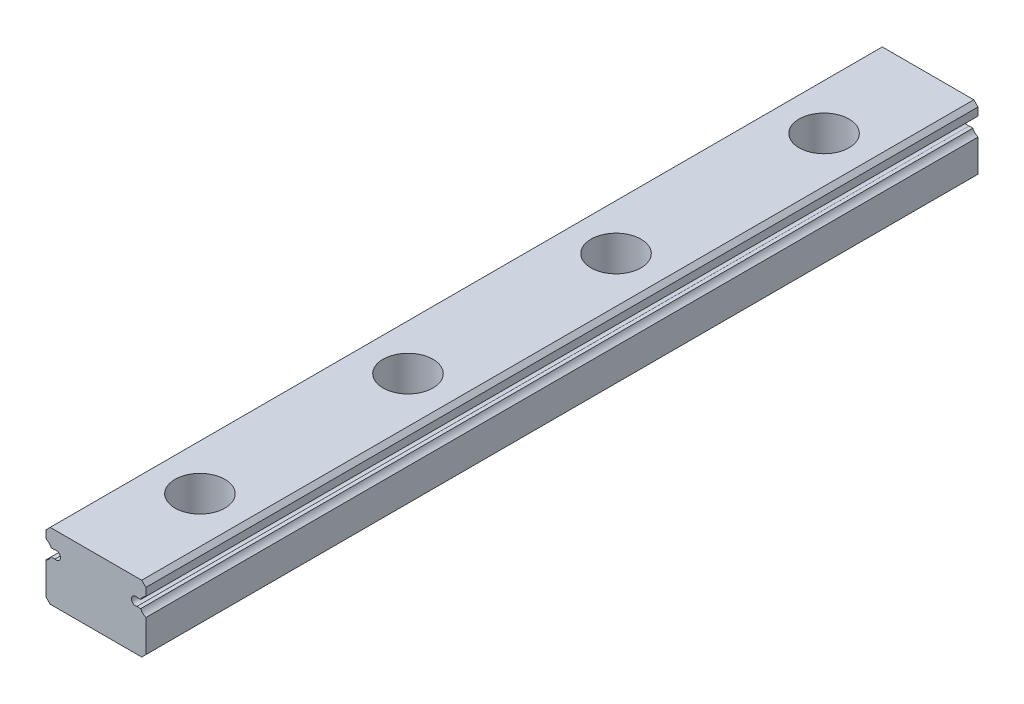
ISO-10303-21;
HEADER;
FILE_DESCRIPTION(('STEP AP214'),'2;1');
FILE_NAME('part.step','',(''),(''),'','','');
FILE_SCHEMA(('AUTOMOTIVE_DESIGN { 1 0 10303 214 1 1 1 1 }'));
ENDSEC;
DATA;
#1=APPLICATION_CONTEXT('core data for automotive mechanical design processes');
#2=APPLICATION_PROTOCOL_DEFINITION('international standard','automotive_design',2000,#1);
#3=PRODUCT_CONTEXT('',#1,'mechanical');
#4=PRODUCT('Part','Part','',(#3));
#5=PRODUCT_RELATED_PRODUCT_CATEGORY('part','',(#4));
#6=PRODUCT_DEFINITION_FORMATION('','',#4);
#7=PRODUCT_DEFINITION_CONTEXT('part definition',#1,'design');
#8=PRODUCT_DEFINITION('design','',#6,#7);
#9=PRODUCT_DEFINITION_SHAPE('','',#8);
#10=(LENGTH_UNIT() NAMED_UNIT(*) SI_UNIT(.MILLI.,.METRE.));
#11=(NAMED_UNIT(*) PLANE_ANGLE_UNIT() SI_UNIT($,.RADIAN.));
#12=(NAMED_UNIT(*) SI_UNIT($,.STERADIAN.) SOLID_ANGLE_UNIT());
#13=UNCERTAINTY_MEASURE_WITH_UNIT(LENGTH_MEASURE(1.E-05),#10,'distance_accuracy_value','');
#14=(GEOMETRIC_REPRESENTATION_CONTEXT(3) GLOBAL_UNCERTAINTY_ASSIGNED_CONTEXT((#13)) GLOBAL_UNIT_ASSIGNED_CONTEXT((#10,
#11,#12)) REPRESENTATION_CONTEXT('',''));
#15=CARTESIAN_POINT('',(0.,0.,0.));
#16=DIRECTION('',(0.,0.,1.));
#17=DIRECTION('',(1.,0.,0.));
#18=AXIS2_PLACEMENT_3D('',#15,#16,#17);
#19=CARTESIAN_POINT('',(6.,0.,100.));
#20=DIRECTION('',(-1.,0.,0.));
#21=DIRECTION('',(0.,0.,1.));
#22=AXIS2_PLACEMENT_3D('',#19,#20,#21);
#23=PLANE('',#22);
#24=DIRECTION('',(0.,1.,0.));
#25=VECTOR('',#24,1.);
#26=CARTESIAN_POINT('',(6.,0.,0.));
#27=LINE('',#26,#25);
#28=CARTESIAN_POINT('',(6.,-3.5,0.));
#29=VERTEX_POINT('',#28);
#30=CARTESIAN_POINT('',(6.,0.368911094364901,0.));
#31=VERTEX_POINT('',#30);
#32=EDGE_CURVE('E212',#29,#31,#27,.T.);
#33=ORIENTED_EDGE('',*,*,#32,.T.);
#34=DIRECTION('',(0.,0.,-1.));
#35=VECTOR('',#34,1.);
#36=CARTESIAN_POINT('',(6.,0.368911094364901,100.));
#37=LINE('',#36,#35);
#38=CARTESIAN_POINT('',(6.,0.368911094364901,100.));
#39=VERTEX_POINT('',#38);
#40=EDGE_CURVE('E11',#39,#31,#37,.T.);
#41=ORIENTED_EDGE('',*,*,#40,.F.);
#42=DIRECTION('',(0.,1.,0.));
#43=VECTOR('',#42,1.);
#44=CARTESIAN_POINT('',(6.,0.,100.));
#45=LINE('',#44,#43);
#46=CARTESIAN_POINT('',(6.,-3.5,100.));
#47=VERTEX_POINT('',#46);
#48=EDGE_CURVE('E264',#47,#39,#45,.T.);
#49=ORIENTED_EDGE('',*,*,#48,.F.);
#50=DIRECTION('',(0.,0.,-1.));
#51=VECTOR('',#50,1.);
#52=CARTESIAN_POINT('',(6.,-3.5,100.));
#53=LINE('',#52,#51);
#54=EDGE_CURVE('E208',#47,#29,#53,.T.);
#55=ORIENTED_EDGE('',*,*,#54,.T.);
#56=EDGE_LOOP('',(#33,#41,#49,#55));
#57=FACE_BOUND('',#56,.T.);
#58=ADVANCED_FACE('F45',(#57),#23,.F.);
#59=CARTESIAN_POINT('',(6.475,1.46,100.));
#60=DIRECTION('',(0.,0.,-1.));
#61=DIRECTION('',(-1.,0.,0.));
#62=AXIS2_PLACEMENT_3D('',#59,#60,#61);
#63=CYLINDRICAL_SURFACE('',#62,1.19);
#64=CARTESIAN_POINT('',(6.475,1.46,0.));
#65=DIRECTION('',(0.,0.,1.));
#66=DIRECTION('',(1.,0.,0.));
#67=AXIS2_PLACEMENT_3D('',#64,#65,#66);
#68=CIRCLE('',#67,1.19);
#69=CARTESIAN_POINT('',(5.3839110943649,0.985,0.));
#70=VERTEX_POINT('',#69);
#71=EDGE_CURVE('E215',#31,#70,#68,.F.);
#72=ORIENTED_EDGE('',*,*,#71,.T.);
#73=DIRECTION('',(0.,0.,-1.));
#74=VECTOR('',#73,1.);
#75=CARTESIAN_POINT('',(5.3839110943649,0.985,100.));
#76=LINE('',#75,#74);
#77=CARTESIAN_POINT('',(5.3839110943649,0.985,100.));
#78=VERTEX_POINT('',#77);
#79=EDGE_CURVE('E53',#78,#70,#76,.T.);
#80=ORIENTED_EDGE('',*,*,#79,.F.);
#81=CARTESIAN_POINT('',(6.475,1.46,100.));
#82=DIRECTION('',(0.,0.,1.));
#83=DIRECTION('',(1.,0.,0.));
#84=AXIS2_PLACEMENT_3D('',#81,#82,#83);
#85=CIRCLE('',#84,1.19);
#86=EDGE_CURVE('E136',#39,#78,#85,.F.);
#87=ORIENTED_EDGE('',*,*,#86,.F.);
#88=ORIENTED_EDGE('',*,*,#40,.T.);
#89=EDGE_LOOP('',(#72,#80,#87,#88));
#90=FACE_BOUND('',#89,.T.);
#91=ADVANCED_FACE('F371',(#90),#63,.F.);
#92=CARTESIAN_POINT('',(0.,0.985000000000015,100.));
#93=DIRECTION('',(0.,-1.,0.));
#94=DIRECTION('',(1.,0.,0.));
#95=AXIS2_PLACEMENT_3D('',#92,#93,#94);
#96=PLANE('',#95);
#97=DIRECTION('',(-1.,0.,0.));
#98=VECTOR('',#97,1.);
#99=CARTESIAN_POINT('',(0.,0.985000000000015,0.));
#100=LINE('',#99,#98);
#101=CARTESIAN_POINT('',(4.92112494995996,0.985000000000002,0.));
#102=VERTEX_POINT('',#101);
#103=EDGE_CURVE('E218',#70,#102,#100,.T.);
#104=ORIENTED_EDGE('',*,*,#103,.T.);
#105=DIRECTION('',(0.,0.,-1.));
#106=VECTOR('',#105,1.);
#107=CARTESIAN_POINT('',(4.92112494995996,0.985000000000002,100.));
#108=LINE('',#107,#106);
#109=CARTESIAN_POINT('',(4.92112494995996,0.985000000000002,100.));
#110=VERTEX_POINT('',#109);
#111=EDGE_CURVE('E296',#110,#102,#108,.T.);
#112=ORIENTED_EDGE('',*,*,#111,.F.);
#113=DIRECTION('',(-1.,0.,0.));
#114=VECTOR('',#113,1.);
#115=CARTESIAN_POINT('',(0.,0.985000000000015,100.));
#116=LINE('',#115,#114);
#117=EDGE_CURVE('E304',#78,#110,#116,.T.);
#118=ORIENTED_EDGE('',*,*,#117,.F.);
#119=ORIENTED_EDGE('',*,*,#79,.T.);
#120=EDGE_LOOP('',(#104,#112,#118,#119));
#121=FACE_BOUND('',#120,.T.);
#122=ADVANCED_FACE('F302',(#121),#96,.F.);
#123=CARTESIAN_POINT('',(4.765,1.46,100.));
#124=DIRECTION('',(0.,0.,-1.));
#125=DIRECTION('',(-1.,0.,0.));
#126=AXIS2_PLACEMENT_3D('',#123,#124,#125);
#127=CYLINDRICAL_SURFACE('',#126,0.5);
#128=CARTESIAN_POINT('',(4.765,1.46,0.));
#129=DIRECTION('',(0.,0.,1.));
#130=DIRECTION('',(1.,0.,0.));
#131=AXIS2_PLACEMENT_3D('',#128,#129,#130);
#132=CIRCLE('',#131,0.5);
#133=CARTESIAN_POINT('',(4.92112494995996,1.935,0.));
#134=VERTEX_POINT('',#133);
#135=EDGE_CURVE('E220',#102,#134,#132,.F.);
#136=ORIENTED_EDGE('',*,*,#135,.T.);
#137=DIRECTION('',(0.,0.,-1.));
#138=VECTOR('',#137,1.);
#139=CARTESIAN_POINT('',(4.92112494995996,1.935,100.));
#140=LINE('',#139,#138);
#141=CARTESIAN_POINT('',(4.92112494995996,1.935,100.));
#142=VERTEX_POINT('',#141);
#143=EDGE_CURVE('E294',#142,#134,#140,.T.);
#144=ORIENTED_EDGE('',*,*,#143,.F.);
#145=CARTESIAN_POINT('',(4.765,1.46,100.));
#146=DIRECTION('',(0.,0.,1.));
#147=DIRECTION('',(1.,0.,0.));
#148=AXIS2_PLACEMENT_3D('',#145,#146,#147);
#149=CIRCLE('',#148,0.5);
#150=EDGE_CURVE('E316',#110,#142,#149,.F.);
#151=ORIENTED_EDGE('',*,*,#150,.F.);
#152=ORIENTED_EDGE('',*,*,#111,.T.);
#153=EDGE_LOOP('',(#136,#144,#151,#152));
#154=FACE_BOUND('',#153,.T.);
#155=ADVANCED_FACE('F313',(#154),#127,.F.);
#156=CARTESIAN_POINT('',(0.,1.93500000000002,100.));
#157=DIRECTION('',(0.,-1.,0.));
#158=DIRECTION('',(1.,0.,0.));
#159=AXIS2_PLACEMENT_3D('',#156,#157,#158);
#160=PLANE('',#159);
#161=DIRECTION('',(-1.,0.,0.));
#162=VECTOR('',#161,1.);
#163=CARTESIAN_POINT('',(0.,1.93500000000002,0.));
#164=LINE('',#163,#162);
#165=CARTESIAN_POINT('',(5.3839110943649,1.935,0.));
#166=VERTEX_POINT('',#165);
#167=EDGE_CURVE('E223',#166,#134,#164,.T.);
#168=ORIENTED_EDGE('',*,*,#167,.F.);
#169=DIRECTION('',(0.,0.,-1.));
#170=VECTOR('',#169,1.);
#171=CARTESIAN_POINT('',(5.3839110943649,1.935,100.));
#172=LINE('',#171,#170);
#173=CARTESIAN_POINT('',(5.3839110943649,1.935,100.));
#174=VERTEX_POINT('',#173);
#175=EDGE_CURVE('E292',#174,#166,#172,.T.);
#176=ORIENTED_EDGE('',*,*,#175,.F.);
#177=DIRECTION('',(-1.,0.,0.));
#178=VECTOR('',#177,1.);
#179=CARTESIAN_POINT('',(0.,1.93500000000002,100.));
#180=LINE('',#179,#178);
#181=EDGE_CURVE('E318',#174,#142,#180,.T.);
#182=ORIENTED_EDGE('',*,*,#181,.T.);
#183=ORIENTED_EDGE('',*,*,#143,.T.);
#184=EDGE_LOOP('',(#168,#176,#182,#183));
#185=FACE_BOUND('',#184,.T.);
#186=ADVANCED_FACE('F382',(#185),#160,.T.);
#187=CARTESIAN_POINT('',(6.475,1.46,100.));
#188=DIRECTION('',(0.,0.,-1.));
#189=DIRECTION('',(-1.,0.,0.));
#190=AXIS2_PLACEMENT_3D('',#187,#188,#189);
#191=CYLINDRICAL_SURFACE('',#190,1.19);
#192=CARTESIAN_POINT('',(6.475,1.46,0.));
#193=DIRECTION('',(0.,0.,1.));
#194=DIRECTION('',(1.,0.,0.));
#195=AXIS2_PLACEMENT_3D('',#192,#193,#194);
#196=CIRCLE('',#195,1.19);
#197=CARTESIAN_POINT('',(6.,2.5510889056351,0.));
#198=VERTEX_POINT('',#197);
#199=EDGE_CURVE('E226',#166,#198,#196,.F.);
#200=ORIENTED_EDGE('',*,*,#199,.T.);
#201=DIRECTION('',(0.,0.,-1.));
#202=VECTOR('',#201,1.);
#203=CARTESIAN_POINT('',(6.,2.5510889056351,100.));
#204=LINE('',#203,#202);
#205=CARTESIAN_POINT('',(6.,2.5510889056351,100.));
#206=VERTEX_POINT('',#205);
#207=EDGE_CURVE('E289',#206,#198,#204,.T.);
#208=ORIENTED_EDGE('',*,*,#207,.F.);
#209=CARTESIAN_POINT('',(6.475,1.46,100.));
#210=DIRECTION('',(0.,0.,1.));
#211=DIRECTION('',(1.,0.,0.));
#212=AXIS2_PLACEMENT_3D('',#209,#210,#211);
#213=CIRCLE('',#212,1.19);
#214=EDGE_CURVE('E320',#174,#206,#213,.F.);
#215=ORIENTED_EDGE('',*,*,#214,.F.);
#216=ORIENTED_EDGE('',*,*,#175,.T.);
#217=EDGE_LOOP('',(#200,#208,#215,#216));
#218=FACE_BOUND('',#217,.T.);
#219=ADVANCED_FACE('F385',(#218),#191,.F.);
#220=CARTESIAN_POINT('',(6.00000000000001,0.,100.));
#221=DIRECTION('',(-1.,0.,0.));
#222=DIRECTION('',(0.,-1.,0.));
#223=AXIS2_PLACEMENT_3D('',#220,#221,#222);
#224=PLANE('',#223);
#225=DIRECTION('',(0.,1.,0.));
#226=VECTOR('',#225,1.);
#227=CARTESIAN_POINT('',(6.00000000000001,0.,0.));
#228=LINE('',#227,#226);
#229=CARTESIAN_POINT('',(6.,3.5,0.));
#230=VERTEX_POINT('',#229);
#231=EDGE_CURVE('E228',#198,#230,#228,.T.);
#232=ORIENTED_EDGE('',*,*,#231,.T.);
#233=DIRECTION('',(0.,0.,-1.));
#234=VECTOR('',#233,1.);
#235=CARTESIAN_POINT('',(6.,3.5,100.));
#236=LINE('',#235,#234);
#237=CARTESIAN_POINT('',(6.,3.5,100.));
#238=VERTEX_POINT('',#237);
#239=EDGE_CURVE('E287',#238,#230,#236,.T.);
#240=ORIENTED_EDGE('',*,*,#239,.F.);
#241=DIRECTION('',(0.,1.,0.));
#242=VECTOR('',#241,1.);
#243=CARTESIAN_POINT('',(6.00000000000001,0.,100.));
#244=LINE('',#243,#242);
#245=EDGE_CURVE('E326',#206,#238,#244,.T.);
#246=ORIENTED_EDGE('',*,*,#245,.F.);
#247=ORIENTED_EDGE('',*,*,#207,.T.);
#248=EDGE_LOOP('',(#232,#240,#246,#247));
#249=FACE_BOUND('',#248,.T.);
#250=ADVANCED_FACE('F389',(#249),#224,.F.);
#251=CARTESIAN_POINT('',(4.74999999999999,4.75,100.));
#252=DIRECTION('',(0.707106781186547,0.707106781186548,0.));
#253=DIRECTION('',(-0.707106781186548,0.707106781186547,0.));
#254=AXIS2_PLACEMENT_3D('',#251,#252,#253);
#255=PLANE('',#254);
#256=DIRECTION('',(0.707106781186548,-0.707106781186547,0.));
#257=VECTOR('',#256,1.);
#258=CARTESIAN_POINT('',(4.74999999999999,4.75,0.));
#259=LINE('',#258,#257);
#260=CARTESIAN_POINT('',(5.5,4.,0.));
#261=VERTEX_POINT('',#260);
#262=EDGE_CURVE('E231',#261,#230,#259,.T.);
#263=ORIENTED_EDGE('',*,*,#262,.F.);
#264=DIRECTION('',(0.,0.,-1.));
#265=VECTOR('',#264,1.);
#266=CARTESIAN_POINT('',(5.5,4.,100.));
#267=LINE('',#266,#265);
#268=CARTESIAN_POINT('',(5.5,4.,100.));
#269=VERTEX_POINT('',#268);
#270=EDGE_CURVE('E285',#269,#261,#267,.T.);
#271=ORIENTED_EDGE('',*,*,#270,.F.);
#272=DIRECTION('',(0.707106781186548,-0.707106781186547,0.));
#273=VECTOR('',#272,1.);
#274=CARTESIAN_POINT('',(4.74999999999999,4.75,100.));
#275=LINE('',#274,#273);
#276=EDGE_CURVE('E328',#269,#238,#275,.T.);
#277=ORIENTED_EDGE('',*,*,#276,.T.);
#278=ORIENTED_EDGE('',*,*,#239,.T.);
#279=EDGE_LOOP('',(#263,#271,#277,#278));
#280=FACE_BOUND('',#279,.T.);
#281=ADVANCED_FACE('F393',(#280),#255,.T.);
#282=CARTESIAN_POINT('',(0.,4.,100.));
#283=DIRECTION('',(0.,-1.,0.));
#284=DIRECTION('',(1.,0.,0.));
#285=AXIS2_PLACEMENT_3D('',#282,#283,#284);
#286=PLANE('',#285);
#287=CARTESIAN_POINT('',(0.,4.,87.5));
#288=DIRECTION('',(0.,1.,0.));
#289=DIRECTION('',(-1.,0.,0.));
#290=AXIS2_PLACEMENT_3D('',#287,#288,#289);
#291=CIRCLE('',#290,3.);
#292=CARTESIAN_POINT('',(-3.,4.,87.5));
#293=VERTEX_POINT('',#292);
#294=EDGE_CURVE('E687',#293,#293,#291,.T.);
#295=ORIENTED_EDGE('',*,*,#294,.F.);
#296=EDGE_LOOP('',(#295));
#297=FACE_BOUND('',#296,.T.);
#298=CARTESIAN_POINT('',(0.,4.,62.5));
#299=DIRECTION('',(0.,1.,0.));
#300=DIRECTION('',(-1.,0.,0.));
#301=AXIS2_PLACEMENT_3D('',#298,#299,#300);
#302=CIRCLE('',#301,3.);
#303=CARTESIAN_POINT('',(-3.,4.,62.5));
#304=VERTEX_POINT('',#303);
#305=EDGE_CURVE('E698',#304,#304,#302,.T.);
#306=ORIENTED_EDGE('',*,*,#305,.F.);
#307=EDGE_LOOP('',(#306));
#308=FACE_BOUND('',#307,.T.);
#309=CARTESIAN_POINT('',(0.,4.,37.5));
#310=DIRECTION('',(0.,1.,0.));
#311=DIRECTION('',(-1.,0.,0.));
#312=AXIS2_PLACEMENT_3D('',#309,#310,#311);
#313=CIRCLE('',#312,3.);
#314=CARTESIAN_POINT('',(-3.,4.,37.5));
#315=VERTEX_POINT('',#314);
#316=EDGE_CURVE('E710',#315,#315,#313,.T.);
#317=ORIENTED_EDGE('',*,*,#316,.F.);
#318=EDGE_LOOP('',(#317));
#319=FACE_BOUND('',#318,.T.);
#320=CARTESIAN_POINT('',(0.,4.,12.5));
#321=DIRECTION('',(0.,1.,0.));
#322=DIRECTION('',(-1.,0.,0.));
#323=AXIS2_PLACEMENT_3D('',#320,#321,#322);
#324=CIRCLE('',#323,3.);
#325=CARTESIAN_POINT('',(-3.,4.,12.5));
#326=VERTEX_POINT('',#325);
#327=EDGE_CURVE('E723',#326,#326,#324,.T.);
#328=ORIENTED_EDGE('',*,*,#327,.F.);
#329=EDGE_LOOP('',(#328));
#330=FACE_BOUND('',#329,.T.);
#331=DIRECTION('',(-1.,0.,0.));
#332=VECTOR('',#331,1.);
#333=CARTESIAN_POINT('',(0.,4.,0.));
#334=LINE('',#333,#332);
#335=CARTESIAN_POINT('',(-5.5,4.,0.));
#336=VERTEX_POINT('',#335);
#337=EDGE_CURVE('E234',#261,#336,#334,.T.);
#338=ORIENTED_EDGE('',*,*,#337,.T.);
#339=DIRECTION('',(0.,0.,-1.));
#340=VECTOR('',#339,1.);
#341=CARTESIAN_POINT('',(-5.5,4.,100.));
#342=LINE('',#341,#340);
#343=CARTESIAN_POINT('',(-5.5,4.,100.));
#344=VERTEX_POINT('',#343);
#345=EDGE_CURVE('E282',#344,#336,#342,.T.);
#346=ORIENTED_EDGE('',*,*,#345,.F.);
#347=DIRECTION('',(-1.,0.,0.));
#348=VECTOR('',#347,1.);
#349=CARTESIAN_POINT('',(0.,4.,100.));
#350=LINE('',#349,#348);
#351=EDGE_CURVE('E331',#269,#344,#350,.T.);
#352=ORIENTED_EDGE('',*,*,#351,.F.);
#353=ORIENTED_EDGE('',*,*,#270,.T.);
#354=EDGE_LOOP('',(#338,#346,#352,#353));
#355=FACE_BOUND('',#354,.T.);
#356=ADVANCED_FACE('F397',(#297,#308,#319,#330,#355),#286,.F.);
#357=CARTESIAN_POINT('',(-4.75,4.75,100.));
#358=DIRECTION('',(0.707106781186547,-0.707106781186548,0.));
#359=DIRECTION('',(0.707106781186548,0.707106781186547,0.));
#360=AXIS2_PLACEMENT_3D('',#357,#358,#359);
#361=PLANE('',#360);
#362=DIRECTION('',(-0.707106781186548,-0.707106781186547,0.));
#363=VECTOR('',#362,1.);
#364=CARTESIAN_POINT('',(-4.75,4.75,0.));
#365=LINE('',#364,#363);
#366=CARTESIAN_POINT('',(-6.,3.5,0.));
#367=VERTEX_POINT('',#366);
#368=EDGE_CURVE('E236',#336,#367,#365,.T.);
#369=ORIENTED_EDGE('',*,*,#368,.T.);
#370=DIRECTION('',(0.,0.,-1.));
#371=VECTOR('',#370,1.);
#372=CARTESIAN_POINT('',(-6.,3.5,100.));
#373=LINE('',#372,#371);
#374=CARTESIAN_POINT('',(-6.,3.5,100.));
#375=VERTEX_POINT('',#374);
#376=EDGE_CURVE('E280',#375,#367,#373,.T.);
#377=ORIENTED_EDGE('',*,*,#376,.F.);
#378=DIRECTION('',(-0.707106781186548,-0.707106781186547,0.));
#379=VECTOR('',#378,1.);
#380=CARTESIAN_POINT('',(-4.75,4.75,100.));
#381=LINE('',#380,#379);
#382=EDGE_CURVE('E333',#344,#375,#381,.T.);
#383=ORIENTED_EDGE('',*,*,#382,.F.);
#384=ORIENTED_EDGE('',*,*,#345,.T.);
#385=EDGE_LOOP('',(#369,#377,#383,#384));
#386=FACE_BOUND('',#385,.T.);
#387=ADVANCED_FACE('F401',(#386),#361,.F.);
#388=CARTESIAN_POINT('',(-6.,0.,100.));
#389=DIRECTION('',(-1.,0.,0.));
#390=DIRECTION('',(0.,0.,1.));
#391=AXIS2_PLACEMENT_3D('',#388,#389,#390);
#392=PLANE('',#391);
#393=DIRECTION('',(0.,1.,0.));
#394=VECTOR('',#393,1.);
#395=CARTESIAN_POINT('',(-6.,0.,0.));
#396=LINE('',#395,#394);
#397=CARTESIAN_POINT('',(-6.,2.5510889056351,0.));
#398=VERTEX_POINT('',#397);
#399=EDGE_CURVE('E239',#398,#367,#396,.T.);
#400=ORIENTED_EDGE('',*,*,#399,.F.);
#401=DIRECTION('',(0.,0.,-1.));
#402=VECTOR('',#401,1.);
#403=CARTESIAN_POINT('',(-6.,2.5510889056351,100.));
#404=LINE('',#403,#402);
#405=CARTESIAN_POINT('',(-6.,2.5510889056351,100.));
#406=VERTEX_POINT('',#405);
#407=EDGE_CURVE('E278',#406,#398,#404,.T.);
#408=ORIENTED_EDGE('',*,*,#407,.F.);
#409=DIRECTION('',(0.,1.,0.));
#410=VECTOR('',#409,1.);
#411=CARTESIAN_POINT('',(-6.,0.,100.));
#412=LINE('',#411,#410);
#413=EDGE_CURVE('E335',#406,#375,#412,.T.);
#414=ORIENTED_EDGE('',*,*,#413,.T.);
#415=ORIENTED_EDGE('',*,*,#376,.T.);
#416=EDGE_LOOP('',(#400,#408,#414,#415));
#417=FACE_BOUND('',#416,.T.);
#418=ADVANCED_FACE('F405',(#417),#392,.T.);
#419=CARTESIAN_POINT('',(-6.475,1.46,100.));
#420=DIRECTION('',(0.,0.,-1.));
#421=DIRECTION('',(-1.,0.,0.));
#422=AXIS2_PLACEMENT_3D('',#419,#420,#421);
#423=CYLINDRICAL_SURFACE('',#422,1.19);
#424=CARTESIAN_POINT('',(-6.475,1.46,0.));
#425=DIRECTION('',(0.,0.,1.));
#426=DIRECTION('',(1.,0.,0.));
#427=AXIS2_PLACEMENT_3D('',#424,#425,#426);
#428=CIRCLE('',#427,1.19);
#429=CARTESIAN_POINT('',(-5.3839110943649,1.935,0.));
#430=VERTEX_POINT('',#429);
#431=EDGE_CURVE('E242',#430,#398,#428,.T.);
#432=ORIENTED_EDGE('',*,*,#431,.F.);
#433=DIRECTION('',(0.,0.,-1.));
#434=VECTOR('',#433,1.);
#435=CARTESIAN_POINT('',(-5.3839110943649,1.935,100.));
#436=LINE('',#435,#434);
#437=CARTESIAN_POINT('',(-5.3839110943649,1.935,100.));
#438=VERTEX_POINT('',#437);
#439=EDGE_CURVE('E276',#438,#430,#436,.T.);
#440=ORIENTED_EDGE('',*,*,#439,.F.);
#441=CARTESIAN_POINT('',(-6.475,1.46,100.));
#442=DIRECTION('',(0.,0.,1.));
#443=DIRECTION('',(1.,0.,0.));
#444=AXIS2_PLACEMENT_3D('',#441,#442,#443);
#445=CIRCLE('',#444,1.19);
#446=EDGE_CURVE('E338',#438,#406,#445,.T.);
#447=ORIENTED_EDGE('',*,*,#446,.T.);
#448=ORIENTED_EDGE('',*,*,#407,.T.);
#449=EDGE_LOOP('',(#432,#440,#447,#448));
#450=FACE_BOUND('',#449,.T.);
#451=ADVANCED_FACE('F409',(#450),#423,.F.);
#452=CARTESIAN_POINT('',(0.,1.935,100.));
#453=DIRECTION('',(0.,1.,0.));
#454=DIRECTION('',(0.,0.,1.));
#455=AXIS2_PLACEMENT_3D('',#452,#453,#454);
#456=PLANE('',#455);
#457=DIRECTION('',(1.,0.,0.));
#458=VECTOR('',#457,1.);
#459=CARTESIAN_POINT('',(0.,1.935,0.));
#460=LINE('',#459,#458);
#461=CARTESIAN_POINT('',(-4.92112494995996,1.935,0.));
#462=VERTEX_POINT('',#461);
#463=EDGE_CURVE('E245',#430,#462,#460,.T.);
#464=ORIENTED_EDGE('',*,*,#463,.T.);
#465=DIRECTION('',(0.,0.,-1.));
#466=VECTOR('',#465,1.);
#467=CARTESIAN_POINT('',(-4.92112494995996,1.935,100.));
#468=LINE('',#467,#466);
#469=CARTESIAN_POINT('',(-4.92112494995996,1.935,100.));
#470=VERTEX_POINT('',#469);
#471=EDGE_CURVE('E274',#470,#462,#468,.T.);
#472=ORIENTED_EDGE('',*,*,#471,.F.);
#473=DIRECTION('',(1.,0.,0.));
#474=VECTOR('',#473,1.);
#475=CARTESIAN_POINT('',(0.,1.935,100.));
#476=LINE('',#475,#474);
#477=EDGE_CURVE('E341',#438,#470,#476,.T.);
#478=ORIENTED_EDGE('',*,*,#477,.F.);
#479=ORIENTED_EDGE('',*,*,#439,.T.);
#480=EDGE_LOOP('',(#464,#472,#478,#479));
#481=FACE_BOUND('',#480,.T.);
#482=ADVANCED_FACE('F413',(#481),#456,.F.);
#483=CARTESIAN_POINT('',(-4.765,1.46,100.));
#484=DIRECTION('',(0.,0.,-1.));
#485=DIRECTION('',(-1.,0.,0.));
#486=AXIS2_PLACEMENT_3D('',#483,#484,#485);
#487=CYLINDRICAL_SURFACE('',#486,0.5);
#488=CARTESIAN_POINT('',(-4.765,1.46,0.));
#489=DIRECTION('',(0.,0.,1.));
#490=DIRECTION('',(1.,0.,0.));
#491=AXIS2_PLACEMENT_3D('',#488,#489,#490);
#492=CIRCLE('',#491,0.5);
#493=CARTESIAN_POINT('',(-4.92112494995996,0.984999999999999,0.));
#494=VERTEX_POINT('',#493);
#495=EDGE_CURVE('E248',#494,#462,#492,.T.);
#496=ORIENTED_EDGE('',*,*,#495,.F.);
#497=DIRECTION('',(0.,0.,-1.));
#498=VECTOR('',#497,1.);
#499=CARTESIAN_POINT('',(-4.92112494995996,0.984999999999999,100.));
#500=LINE('',#499,#498);
#501=CARTESIAN_POINT('',(-4.92112494995996,0.984999999999999,100.));
#502=VERTEX_POINT('',#501);
#503=EDGE_CURVE('E272',#502,#494,#500,.T.);
#504=ORIENTED_EDGE('',*,*,#503,.F.);
#505=CARTESIAN_POINT('',(-4.765,1.46,100.));
#506=DIRECTION('',(0.,0.,1.));
#507=DIRECTION('',(1.,0.,0.));
#508=AXIS2_PLACEMENT_3D('',#505,#506,#507);
#509=CIRCLE('',#508,0.5);
#510=EDGE_CURVE('E343',#502,#470,#509,.T.);
#511=ORIENTED_EDGE('',*,*,#510,.T.);
#512=ORIENTED_EDGE('',*,*,#471,.T.);
#513=EDGE_LOOP('',(#496,#504,#511,#512));
#514=FACE_BOUND('',#513,.T.);
#515=ADVANCED_FACE('F417',(#514),#487,.F.);
#516=CARTESIAN_POINT('',(0.,0.984999999999999,100.));
#517=DIRECTION('',(0.,1.,0.));
#518=DIRECTION('',(0.,0.,1.));
#519=AXIS2_PLACEMENT_3D('',#516,#517,#518);
#520=PLANE('',#519);
#521=DIRECTION('',(1.,0.,0.));
#522=VECTOR('',#521,1.);
#523=CARTESIAN_POINT('',(0.,0.984999999999999,0.));
#524=LINE('',#523,#522);
#525=CARTESIAN_POINT('',(-5.3839110943649,0.984999999999999,0.));
#526=VERTEX_POINT('',#525);
#527=EDGE_CURVE('E251',#526,#494,#524,.T.);
#528=ORIENTED_EDGE('',*,*,#527,.F.);
#529=DIRECTION('',(0.,0.,-1.));
#530=VECTOR('',#529,1.);
#531=CARTESIAN_POINT('',(-5.3839110943649,0.984999999999999,100.));
#532=LINE('',#531,#530);
#533=CARTESIAN_POINT('',(-5.3839110943649,0.984999999999999,100.));
#534=VERTEX_POINT('',#533);
#535=EDGE_CURVE('E270',#534,#526,#532,.T.);
#536=ORIENTED_EDGE('',*,*,#535,.F.);
#537=DIRECTION('',(1.,0.,0.));
#538=VECTOR('',#537,1.);
#539=CARTESIAN_POINT('',(0.,0.984999999999999,100.));
#540=LINE('',#539,#538);
#541=EDGE_CURVE('E346',#534,#502,#540,.T.);
#542=ORIENTED_EDGE('',*,*,#541,.T.);
#543=ORIENTED_EDGE('',*,*,#503,.T.);
#544=EDGE_LOOP('',(#528,#536,#542,#543));
#545=FACE_BOUND('',#544,.T.);
#546=ADVANCED_FACE('F421',(#545),#520,.T.);
#547=CARTESIAN_POINT('',(-6.475,1.46,100.));
#548=DIRECTION('',(0.,0.,-1.));
#549=DIRECTION('',(-1.,0.,0.));
#550=AXIS2_PLACEMENT_3D('',#547,#548,#549);
#551=CYLINDRICAL_SURFACE('',#550,1.19);
#552=CARTESIAN_POINT('',(-6.475,1.46,0.));
#553=DIRECTION('',(0.,0.,1.));
#554=DIRECTION('',(1.,0.,0.));
#555=AXIS2_PLACEMENT_3D('',#552,#553,#554);
#556=CIRCLE('',#555,1.19);
#557=CARTESIAN_POINT('',(-6.,0.3689110943649,0.));
#558=VERTEX_POINT('',#557);
#559=EDGE_CURVE('E254',#558,#526,#556,.T.);
#560=ORIENTED_EDGE('',*,*,#559,.F.);
#561=DIRECTION('',(0.,0.,-1.));
#562=VECTOR('',#561,1.);
#563=CARTESIAN_POINT('',(-6.,0.3689110943649,100.));
#564=LINE('',#563,#562);
#565=CARTESIAN_POINT('',(-6.,0.3689110943649,100.));
#566=VERTEX_POINT('',#565);
#567=EDGE_CURVE('E268',#566,#558,#564,.T.);
#568=ORIENTED_EDGE('',*,*,#567,.F.);
#569=CARTESIAN_POINT('',(-6.475,1.46,100.));
#570=DIRECTION('',(0.,0.,1.));
#571=DIRECTION('',(1.,0.,0.));
#572=AXIS2_PLACEMENT_3D('',#569,#570,#571);
#573=CIRCLE('',#572,1.19);
#574=EDGE_CURVE('E349',#566,#534,#573,.T.);
#575=ORIENTED_EDGE('',*,*,#574,.T.);
#576=ORIENTED_EDGE('',*,*,#535,.T.);
#577=EDGE_LOOP('',(#560,#568,#575,#576));
#578=FACE_BOUND('',#577,.T.);
#579=ADVANCED_FACE('F425',(#578),#551,.F.);
#580=CARTESIAN_POINT('',(-6.,0.,100.));
#581=DIRECTION('',(-1.,0.,0.));
#582=DIRECTION('',(0.,0.,1.));
#583=AXIS2_PLACEMENT_3D('',#580,#581,#582);
#584=PLANE('',#583);
#585=DIRECTION('',(0.,1.,0.));
#586=VECTOR('',#585,1.);
#587=CARTESIAN_POINT('',(-6.,0.,0.));
#588=LINE('',#587,#586);
#589=CARTESIAN_POINT('',(-6.,-3.5,0.));
#590=VERTEX_POINT('',#589);
#591=EDGE_CURVE('E257',#590,#558,#588,.T.);
#592=ORIENTED_EDGE('',*,*,#591,.F.);
#593=DIRECTION('',(0.,0.,-1.));
#594=VECTOR('',#593,1.);
#595=CARTESIAN_POINT('',(-6.,-3.5,100.));
#596=LINE('',#595,#594);
#597=CARTESIAN_POINT('',(-6.,-3.5,100.));
#598=VERTEX_POINT('',#597);
#599=EDGE_CURVE('E197',#598,#590,#596,.T.);
#600=ORIENTED_EDGE('',*,*,#599,.F.);
#601=DIRECTION('',(0.,1.,0.));
#602=VECTOR('',#601,1.);
#603=CARTESIAN_POINT('',(-6.,0.,100.));
#604=LINE('',#603,#602);
#605=EDGE_CURVE('E204',#598,#566,#604,.T.);
#606=ORIENTED_EDGE('',*,*,#605,.T.);
#607=ORIENTED_EDGE('',*,*,#567,.T.);
#608=EDGE_LOOP('',(#592,#600,#606,#607));
#609=FACE_BOUND('',#608,.T.);
#610=ADVANCED_FACE('F353',(#609),#584,.T.);
#611=CARTESIAN_POINT('',(-4.75,-4.75,100.));
#612=DIRECTION('',(-0.707106781186548,-0.707106781186547,0.));
#613=DIRECTION('',(0.707106781186547,-0.707106781186548,0.));
#614=AXIS2_PLACEMENT_3D('',#611,#612,#613);
#615=PLANE('',#614);
#616=DIRECTION('',(-0.707106781186547,0.707106781186548,0.));
#617=VECTOR('',#616,1.);
#618=CARTESIAN_POINT('',(-4.75,-4.75,0.));
#619=LINE('',#618,#617);
#620=CARTESIAN_POINT('',(-5.5,-4.,0.));
#621=VERTEX_POINT('',#620);
#622=EDGE_CURVE('E192',#621,#590,#619,.T.);
#623=ORIENTED_EDGE('',*,*,#622,.F.);
#624=DIRECTION('',(0.,0.,-1.));
#625=VECTOR('',#624,1.);
#626=CARTESIAN_POINT('',(-5.5,-4.,100.));
#627=LINE('',#626,#625);
#628=CARTESIAN_POINT('',(-5.5,-4.,100.));
#629=VERTEX_POINT('',#628);
#630=EDGE_CURVE('E187',#629,#621,#627,.T.);
#631=ORIENTED_EDGE('',*,*,#630,.F.);
#632=DIRECTION('',(-0.707106781186547,0.707106781186548,0.));
#633=VECTOR('',#632,1.);
#634=CARTESIAN_POINT('',(-4.75,-4.75,100.));
#635=LINE('',#634,#633);
#636=EDGE_CURVE('E190',#629,#598,#635,.T.);
#637=ORIENTED_EDGE('',*,*,#636,.T.);
#638=ORIENTED_EDGE('',*,*,#599,.T.);
#639=EDGE_LOOP('',(#623,#631,#637,#638));
#640=FACE_BOUND('',#639,.T.);
#641=ADVANCED_FACE('F189',(#640),#615,.T.);
#642=CARTESIAN_POINT('',(0.,-4.,100.));
#643=DIRECTION('',(0.,-1.,0.));
#644=DIRECTION('',(1.,0.,0.));
#645=AXIS2_PLACEMENT_3D('',#642,#643,#644);
#646=PLANE('',#645);
#647=CARTESIAN_POINT('',(0.,-4.,87.5));
#648=DIRECTION('',(0.,1.,0.));
#649=DIRECTION('',(-1.,0.,0.));
#650=AXIS2_PLACEMENT_3D('',#647,#648,#649);
#651=CIRCLE('',#650,1.75);
#652=CARTESIAN_POINT('',(-1.75,-4.,87.5));
#653=VERTEX_POINT('',#652);
#654=EDGE_CURVE('E682',#653,#653,#651,.T.);
#655=ORIENTED_EDGE('',*,*,#654,.T.);
#656=EDGE_LOOP('',(#655));
#657=FACE_BOUND('',#656,.T.);
#658=CARTESIAN_POINT('',(0.,-4.,62.5));
#659=DIRECTION('',(0.,1.,0.));
#660=DIRECTION('',(-1.,0.,0.));
#661=AXIS2_PLACEMENT_3D('',#658,#659,#660);
#662=CIRCLE('',#661,1.75);
#663=CARTESIAN_POINT('',(-1.75,-4.,62.5));
#664=VERTEX_POINT('',#663);
#665=EDGE_CURVE('E690',#664,#664,#662,.T.);
#666=ORIENTED_EDGE('',*,*,#665,.T.);
#667=EDGE_LOOP('',(#666));
#668=FACE_BOUND('',#667,.T.);
#669=CARTESIAN_POINT('',(0.,-4.,37.5));
#670=DIRECTION('',(0.,1.,0.));
#671=DIRECTION('',(-1.,0.,0.));
#672=AXIS2_PLACEMENT_3D('',#669,#670,#671);
#673=CIRCLE('',#672,1.75);
#674=CARTESIAN_POINT('',(-1.75,-4.,37.5));
#675=VERTEX_POINT('',#674);
#676=EDGE_CURVE('E707',#675,#675,#673,.T.);
#677=ORIENTED_EDGE('',*,*,#676,.T.);
#678=EDGE_LOOP('',(#677));
#679=FACE_BOUND('',#678,.T.);
#680=CARTESIAN_POINT('',(0.,-4.,12.5));
#681=DIRECTION('',(0.,1.,0.));
#682=DIRECTION('',(-1.,0.,0.));
#683=AXIS2_PLACEMENT_3D('',#680,#681,#682);
#684=CIRCLE('',#683,1.75);
#685=CARTESIAN_POINT('',(-1.75,-4.,12.5));
#686=VERTEX_POINT('',#685);
#687=EDGE_CURVE('E720',#686,#686,#684,.T.);
#688=ORIENTED_EDGE('',*,*,#687,.T.);
#689=EDGE_LOOP('',(#688));
#690=FACE_BOUND('',#689,.T.);
#691=DIRECTION('',(-1.,0.,0.));
#692=VECTOR('',#691,1.);
#693=CARTESIAN_POINT('',(0.,-4.,0.));
#694=LINE('',#693,#692);
#695=CARTESIAN_POINT('',(5.5,-4.,0.));
#696=VERTEX_POINT('',#695);
#697=EDGE_CURVE('E261',#696,#621,#694,.T.);
#698=ORIENTED_EDGE('',*,*,#697,.F.);
#699=DIRECTION('',(0.,0.,-1.));
#700=VECTOR('',#699,1.);
#701=CARTESIAN_POINT('',(5.5,-4.,100.));
#702=LINE('',#701,#700);
#703=CARTESIAN_POINT('',(5.5,-4.,100.));
#704=VERTEX_POINT('',#703);
#705=EDGE_CURVE('E125',#704,#696,#702,.T.);
#706=ORIENTED_EDGE('',*,*,#705,.F.);
#707=DIRECTION('',(-1.,0.,0.));
#708=VECTOR('',#707,1.);
#709=CARTESIAN_POINT('',(0.,-4.,100.));
#710=LINE('',#709,#708);
#711=EDGE_CURVE('E201',#704,#629,#710,.T.);
#712=ORIENTED_EDGE('',*,*,#711,.T.);
#713=ORIENTED_EDGE('',*,*,#630,.T.);
#714=EDGE_LOOP('',(#698,#706,#712,#713));
#715=FACE_BOUND('',#714,.T.);
#716=ADVANCED_FACE('F206',(#657,#668,#679,#690,#715),#646,.T.);
#717=CARTESIAN_POINT('',(4.75,-4.75,100.));
#718=DIRECTION('',(-0.707106781186548,0.707106781186547,0.));
#719=DIRECTION('',(-0.707106781186547,-0.707106781186548,0.));
#720=AXIS2_PLACEMENT_3D('',#717,#718,#719);
#721=PLANE('',#720);
#722=DIRECTION('',(0.707106781186547,0.707106781186548,0.));
#723=VECTOR('',#722,1.);
#724=CARTESIAN_POINT('',(4.75,-4.75,0.));
#725=LINE('',#724,#723);
#726=EDGE_CURVE('E128',#696,#29,#725,.T.);
#727=ORIENTED_EDGE('',*,*,#726,.T.);
#728=ORIENTED_EDGE('',*,*,#54,.F.);
#729=DIRECTION('',(0.707106781186547,0.707106781186548,0.));
#730=VECTOR('',#729,1.);
#731=CARTESIAN_POINT('',(4.75,-4.75,100.));
#732=LINE('',#731,#730);
#733=EDGE_CURVE('E61',#704,#47,#732,.T.);
#734=ORIENTED_EDGE('',*,*,#733,.F.);
#735=ORIENTED_EDGE('',*,*,#705,.T.);
#736=EDGE_LOOP('',(#727,#728,#734,#735));
#737=FACE_BOUND('',#736,.T.);
#738=ADVANCED_FACE('F358',(#737),#721,.F.);
#739=CARTESIAN_POINT('',(0.,0.,100.));
#740=DIRECTION('',(0.,0.,1.));
#741=DIRECTION('',(1.,0.,0.));
#742=AXIS2_PLACEMENT_3D('',#739,#740,#741);
#743=PLANE('',#742);
#744=ORIENTED_EDGE('',*,*,#48,.T.);
#745=ORIENTED_EDGE('',*,*,#86,.T.);
#746=ORIENTED_EDGE('',*,*,#117,.T.);
#747=ORIENTED_EDGE('',*,*,#150,.T.);
#748=ORIENTED_EDGE('',*,*,#181,.F.);
#749=ORIENTED_EDGE('',*,*,#214,.T.);
#750=ORIENTED_EDGE('',*,*,#245,.T.);
#751=ORIENTED_EDGE('',*,*,#276,.F.);
#752=ORIENTED_EDGE('',*,*,#351,.T.);
#753=ORIENTED_EDGE('',*,*,#382,.T.);
#754=ORIENTED_EDGE('',*,*,#413,.F.);
#755=ORIENTED_EDGE('',*,*,#446,.F.);
#756=ORIENTED_EDGE('',*,*,#477,.T.);
#757=ORIENTED_EDGE('',*,*,#510,.F.);
#758=ORIENTED_EDGE('',*,*,#541,.F.);
#759=ORIENTED_EDGE('',*,*,#574,.F.);
#760=ORIENTED_EDGE('',*,*,#605,.F.);
#761=ORIENTED_EDGE('',*,*,#636,.F.);
#762=ORIENTED_EDGE('',*,*,#711,.F.);
#763=ORIENTED_EDGE('',*,*,#733,.T.);
#764=EDGE_LOOP('',(#744,#745,#746,#747,#748,#749,#750,#751,#752,#753,#754,#755,#756,#757,#758,
#759,#760,#761,#762,#763));
#765=FACE_BOUND('',#764,.T.);
#766=ADVANCED_FACE('F200',(#765),#743,.T.);
#767=CARTESIAN_POINT('',(0.,0.,0.));
#768=DIRECTION('',(0.,0.,1.));
#769=DIRECTION('',(1.,0.,0.));
#770=AXIS2_PLACEMENT_3D('',#767,#768,#769);
#771=PLANE('',#770);
#772=ORIENTED_EDGE('',*,*,#32,.F.);
#773=ORIENTED_EDGE('',*,*,#726,.F.);
#774=ORIENTED_EDGE('',*,*,#697,.T.);
#775=ORIENTED_EDGE('',*,*,#622,.T.);
#776=ORIENTED_EDGE('',*,*,#591,.T.);
#777=ORIENTED_EDGE('',*,*,#559,.T.);
#778=ORIENTED_EDGE('',*,*,#527,.T.);
#779=ORIENTED_EDGE('',*,*,#495,.T.);
#780=ORIENTED_EDGE('',*,*,#463,.F.);
#781=ORIENTED_EDGE('',*,*,#431,.T.);
#782=ORIENTED_EDGE('',*,*,#399,.T.);
#783=ORIENTED_EDGE('',*,*,#368,.F.);
#784=ORIENTED_EDGE('',*,*,#337,.F.);
#785=ORIENTED_EDGE('',*,*,#262,.T.);
#786=ORIENTED_EDGE('',*,*,#231,.F.);
#787=ORIENTED_EDGE('',*,*,#199,.F.);
#788=ORIENTED_EDGE('',*,*,#167,.T.);
#789=ORIENTED_EDGE('',*,*,#135,.F.);
#790=ORIENTED_EDGE('',*,*,#103,.F.);
#791=ORIENTED_EDGE('',*,*,#71,.F.);
#792=EDGE_LOOP('',(#772,#773,#774,#775,#776,#777,#778,#779,#780,#781,#782,#783,#784,#785,#786,
#787,#788,#789,#790,#791));
#793=FACE_BOUND('',#792,.T.);
#794=ADVANCED_FACE('F308',(#793),#771,.F.);
#795=CARTESIAN_POINT('',(0.,-0.499999999999999,12.5));
#796=DIRECTION('',(0.,1.,0.));
#797=DIRECTION('',(-1.,0.,0.));
#798=AXIS2_PLACEMENT_3D('',#795,#796,#797);
#799=CYLINDRICAL_SURFACE('',#798,3.);
#800=CARTESIAN_POINT('',(0.,-0.499999999999999,12.5));
#801=DIRECTION('',(0.,1.,0.));
#802=DIRECTION('',(-1.,0.,0.));
#803=AXIS2_PLACEMENT_3D('',#800,#801,#802);
#804=CIRCLE('',#803,3.);
#805=CARTESIAN_POINT('',(-3.,-0.5,12.5));
#806=VERTEX_POINT('',#805);
#807=EDGE_CURVE('E216',#806,#806,#804,.T.);
#808=ORIENTED_EDGE('',*,*,#807,.F.);
#809=EDGE_LOOP('',(#808));
#810=FACE_BOUND('',#809,.T.);
#811=ORIENTED_EDGE('',*,*,#327,.T.);
#812=EDGE_LOOP('',(#811));
#813=FACE_BOUND('',#812,.T.);
#814=ADVANCED_FACE('F554',(#810,#813),#799,.F.);
#815=CARTESIAN_POINT('',(0.,-0.499999999999999,12.5));
#816=DIRECTION('',(0.,1.,0.));
#817=DIRECTION('',(-1.,0.,0.));
#818=AXIS2_PLACEMENT_3D('',#815,#816,#817);
#819=PLANE('',#818);
#820=CARTESIAN_POINT('',(0.,-0.499999999999999,12.5));
#821=DIRECTION('',(0.,1.,0.));
#822=DIRECTION('',(-1.,0.,0.));
#823=AXIS2_PLACEMENT_3D('',#820,#821,#822);
#824=CIRCLE('',#823,1.75);
#825=CARTESIAN_POINT('',(-1.75,-0.499999999999999,12.5));
#826=VERTEX_POINT('',#825);
#827=EDGE_CURVE('E719',#826,#826,#824,.T.);
#828=ORIENTED_EDGE('',*,*,#827,.F.);
#829=EDGE_LOOP('',(#828));
#830=FACE_BOUND('',#829,.T.);
#831=ORIENTED_EDGE('',*,*,#807,.T.);
#832=EDGE_LOOP('',(#831));
#833=FACE_BOUND('',#832,.T.);
#834=ADVANCED_FACE('F561',(#830,#833),#819,.T.);
#835=CARTESIAN_POINT('',(0.,-4.,12.5));
#836=DIRECTION('',(0.,1.,0.));
#837=DIRECTION('',(-1.,0.,0.));
#838=AXIS2_PLACEMENT_3D('',#835,#836,#837);
#839=CYLINDRICAL_SURFACE('',#838,1.75);
#840=ORIENTED_EDGE('',*,*,#687,.F.);
#841=EDGE_LOOP('',(#840));
#842=FACE_BOUND('',#841,.T.);
#843=ORIENTED_EDGE('',*,*,#827,.T.);
#844=EDGE_LOOP('',(#843));
#845=FACE_BOUND('',#844,.T.);
#846=ADVANCED_FACE('F570',(#842,#845),#839,.F.);
#847=CARTESIAN_POINT('',(0.,-0.499999999999999,37.5));
#848=DIRECTION('',(0.,1.,0.));
#849=DIRECTION('',(-1.,0.,0.));
#850=AXIS2_PLACEMENT_3D('',#847,#848,#849);
#851=CYLINDRICAL_SURFACE('',#850,3.);
#852=CARTESIAN_POINT('',(0.,-0.499999999999999,37.5));
#853=DIRECTION('',(0.,1.,0.));
#854=DIRECTION('',(-1.,0.,0.));
#855=AXIS2_PLACEMENT_3D('',#852,#853,#854);
#856=CIRCLE('',#855,3.);
#857=CARTESIAN_POINT('',(-3.,-0.5,37.5));
#858=VERTEX_POINT('',#857);
#859=EDGE_CURVE('E716',#858,#858,#856,.T.);
#860=ORIENTED_EDGE('',*,*,#859,.F.);
#861=EDGE_LOOP('',(#860));
#862=FACE_BOUND('',#861,.T.);
#863=ORIENTED_EDGE('',*,*,#316,.T.);
#864=EDGE_LOOP('',(#863));
#865=FACE_BOUND('',#864,.T.);
#866=ADVANCED_FACE('F579',(#862,#865),#851,.F.);
#867=CARTESIAN_POINT('',(0.,-0.499999999999999,37.5));
#868=DIRECTION('',(0.,1.,0.));
#869=DIRECTION('',(-1.,0.,0.));
#870=AXIS2_PLACEMENT_3D('',#867,#868,#869);
#871=PLANE('',#870);
#872=CARTESIAN_POINT('',(0.,-0.499999999999999,37.5));
#873=DIRECTION('',(0.,1.,0.));
#874=DIRECTION('',(-1.,0.,0.));
#875=AXIS2_PLACEMENT_3D('',#872,#873,#874);
#876=CIRCLE('',#875,1.75);
#877=CARTESIAN_POINT('',(-1.75,-0.499999999999999,37.5));
#878=VERTEX_POINT('',#877);
#879=EDGE_CURVE('E713',#878,#878,#876,.T.);
#880=ORIENTED_EDGE('',*,*,#879,.F.);
#881=EDGE_LOOP('',(#880));
#882=FACE_BOUND('',#881,.T.);
#883=ORIENTED_EDGE('',*,*,#859,.T.);
#884=EDGE_LOOP('',(#883));
#885=FACE_BOUND('',#884,.T.);
#886=ADVANCED_FACE('F588',(#882,#885),#871,.T.);
#887=CARTESIAN_POINT('',(0.,-4.,37.5));
#888=DIRECTION('',(0.,1.,0.));
#889=DIRECTION('',(-1.,0.,0.));
#890=AXIS2_PLACEMENT_3D('',#887,#888,#889);
#891=CYLINDRICAL_SURFACE('',#890,1.75);
#892=ORIENTED_EDGE('',*,*,#676,.F.);
#893=EDGE_LOOP('',(#892));
#894=FACE_BOUND('',#893,.T.);
#895=ORIENTED_EDGE('',*,*,#879,.T.);
#896=EDGE_LOOP('',(#895));
#897=FACE_BOUND('',#896,.T.);
#898=ADVANCED_FACE('F597',(#894,#897),#891,.F.);
#899=CARTESIAN_POINT('',(0.,-0.499999999999999,62.5));
#900=DIRECTION('',(0.,1.,0.));
#901=DIRECTION('',(-1.,0.,0.));
#902=AXIS2_PLACEMENT_3D('',#899,#900,#901);
#903=CYLINDRICAL_SURFACE('',#902,3.);
#904=CARTESIAN_POINT('',(0.,-0.499999999999999,62.5));
#905=DIRECTION('',(0.,1.,0.));
#906=DIRECTION('',(-1.,0.,0.));
#907=AXIS2_PLACEMENT_3D('',#904,#905,#906);
#908=CIRCLE('',#907,3.);
#909=CARTESIAN_POINT('',(-3.,-0.5,62.5));
#910=VERTEX_POINT('',#909);
#911=EDGE_CURVE('E704',#910,#910,#908,.T.);
#912=ORIENTED_EDGE('',*,*,#911,.F.);
#913=EDGE_LOOP('',(#912));
#914=FACE_BOUND('',#913,.T.);
#915=ORIENTED_EDGE('',*,*,#305,.T.);
#916=EDGE_LOOP('',(#915));
#917=FACE_BOUND('',#916,.T.);
#918=ADVANCED_FACE('F606',(#914,#917),#903,.F.);
#919=CARTESIAN_POINT('',(0.,-0.499999999999999,62.5));
#920=DIRECTION('',(0.,1.,0.));
#921=DIRECTION('',(-1.,0.,0.));
#922=AXIS2_PLACEMENT_3D('',#919,#920,#921);
#923=PLANE('',#922);
#924=CARTESIAN_POINT('',(0.,-0.499999999999999,62.5));
#925=DIRECTION('',(0.,1.,0.));
#926=DIRECTION('',(-1.,0.,0.));
#927=AXIS2_PLACEMENT_3D('',#924,#925,#926);
#928=CIRCLE('',#927,1.75);
#929=CARTESIAN_POINT('',(-1.75,-0.499999999999999,62.5));
#930=VERTEX_POINT('',#929);
#931=EDGE_CURVE('E701',#930,#930,#928,.T.);
#932=ORIENTED_EDGE('',*,*,#931,.F.);
#933=EDGE_LOOP('',(#932));
#934=FACE_BOUND('',#933,.T.);
#935=ORIENTED_EDGE('',*,*,#911,.T.);
#936=EDGE_LOOP('',(#935));
#937=FACE_BOUND('',#936,.T.);
#938=ADVANCED_FACE('F615',(#934,#937),#923,.T.);
#939=CARTESIAN_POINT('',(0.,-4.,62.5));
#940=DIRECTION('',(0.,1.,0.));
#941=DIRECTION('',(-1.,0.,0.));
#942=AXIS2_PLACEMENT_3D('',#939,#940,#941);
#943=CYLINDRICAL_SURFACE('',#942,1.75);
#944=ORIENTED_EDGE('',*,*,#665,.F.);
#945=EDGE_LOOP('',(#944));
#946=FACE_BOUND('',#945,.T.);
#947=ORIENTED_EDGE('',*,*,#931,.T.);
#948=EDGE_LOOP('',(#947));
#949=FACE_BOUND('',#948,.T.);
#950=ADVANCED_FACE('F624',(#946,#949),#943,.F.);
#951=CARTESIAN_POINT('',(0.,-0.499999999999999,87.5));
#952=DIRECTION('',(0.,1.,0.));
#953=DIRECTION('',(-1.,0.,0.));
#954=AXIS2_PLACEMENT_3D('',#951,#952,#953);
#955=CYLINDRICAL_SURFACE('',#954,3.);
#956=CARTESIAN_POINT('',(0.,-0.499999999999999,87.5));
#957=DIRECTION('',(0.,1.,0.));
#958=DIRECTION('',(-1.,0.,0.));
#959=AXIS2_PLACEMENT_3D('',#956,#957,#958);
#960=CIRCLE('',#959,3.);
#961=CARTESIAN_POINT('',(-3.,-0.5,87.5));
#962=VERTEX_POINT('',#961);
#963=EDGE_CURVE('E686',#962,#962,#960,.T.);
#964=ORIENTED_EDGE('',*,*,#963,.F.);
#965=EDGE_LOOP('',(#964));
#966=FACE_BOUND('',#965,.T.);
#967=ORIENTED_EDGE('',*,*,#294,.T.);
#968=EDGE_LOOP('',(#967));
#969=FACE_BOUND('',#968,.T.);
#970=ADVANCED_FACE('F633',(#966,#969),#955,.F.);
#971=CARTESIAN_POINT('',(0.,-0.499999999999999,87.5));
#972=DIRECTION('',(0.,1.,0.));
#973=DIRECTION('',(-1.,0.,0.));
#974=AXIS2_PLACEMENT_3D('',#971,#972,#973);
#975=PLANE('',#974);
#976=CARTESIAN_POINT('',(0.,-0.499999999999999,87.5));
#977=DIRECTION('',(0.,1.,0.));
#978=DIRECTION('',(-1.,0.,0.));
#979=AXIS2_PLACEMENT_3D('',#976,#977,#978);
#980=CIRCLE('',#979,1.75);
#981=CARTESIAN_POINT('',(-1.75,-0.499999999999999,87.5));
#982=VERTEX_POINT('',#981);
#983=EDGE_CURVE('E685',#982,#982,#980,.T.);
#984=ORIENTED_EDGE('',*,*,#983,.F.);
#985=EDGE_LOOP('',(#984));
#986=FACE_BOUND('',#985,.T.);
#987=ORIENTED_EDGE('',*,*,#963,.T.);
#988=EDGE_LOOP('',(#987));
#989=FACE_BOUND('',#988,.T.);
#990=ADVANCED_FACE('F642',(#986,#989),#975,.T.);
#991=CARTESIAN_POINT('',(0.,-4.,87.5));
#992=DIRECTION('',(0.,1.,0.));
#993=DIRECTION('',(-1.,0.,0.));
#994=AXIS2_PLACEMENT_3D('',#991,#992,#993);
#995=CYLINDRICAL_SURFACE('',#994,1.75);
#996=ORIENTED_EDGE('',*,*,#654,.F.);
#997=EDGE_LOOP('',(#996));
#998=FACE_BOUND('',#997,.T.);
#999=ORIENTED_EDGE('',*,*,#983,.T.);
#1000=EDGE_LOOP('',(#999));
#1001=FACE_BOUND('',#1000,.T.);
#1002=ADVANCED_FACE('F651',(#998,#1001),#995,.F.);
#1003=CLOSED_SHELL('',(#58,#91,#122,#155,#186,#219,#250,#281,#356,#387,#418,#451,#482,#515,#546,
#579,#610,#641,#716,#738,#766,#794,#814,#834,#846,#866,#886,#898,#918,#938,#950,#970,#990,#1002));
#1004=MANIFOLD_SOLID_BREP('B2',#1003);
#1005=ADVANCED_BREP_SHAPE_REPRESENTATION('',(#18,#1004),#14);
#1006=SHAPE_DEFINITION_REPRESENTATION(#9,#1005);
ENDSEC;
END-ISO-10303-21;
